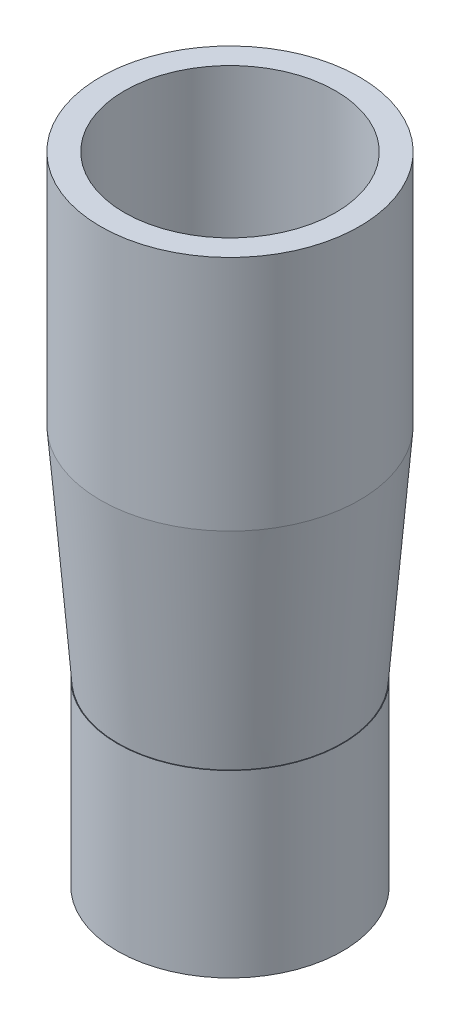
ISO-10303-21;
HEADER;
FILE_DESCRIPTION(('STEP AP214'),'2;1');
FILE_NAME('part.step','',(''),(''),'','','');
FILE_SCHEMA(('AUTOMOTIVE_DESIGN { 1 0 10303 214 1 1 1 1 }'));
ENDSEC;
DATA;
#1=APPLICATION_CONTEXT('core data for automotive mechanical design processes');
#2=APPLICATION_PROTOCOL_DEFINITION('international standard','automotive_design',2000,#1);
#3=PRODUCT_CONTEXT('',#1,'mechanical');
#4=PRODUCT('Part','Part','',(#3));
#5=PRODUCT_RELATED_PRODUCT_CATEGORY('part','',(#4));
#6=PRODUCT_DEFINITION_FORMATION('','',#4);
#7=PRODUCT_DEFINITION_CONTEXT('part definition',#1,'design');
#8=PRODUCT_DEFINITION('design','',#6,#7);
#9=PRODUCT_DEFINITION_SHAPE('','',#8);
#10=(LENGTH_UNIT() NAMED_UNIT(*) SI_UNIT(.MILLI.,.METRE.));
#11=(NAMED_UNIT(*) PLANE_ANGLE_UNIT() SI_UNIT($,.RADIAN.));
#12=(NAMED_UNIT(*) SI_UNIT($,.STERADIAN.) SOLID_ANGLE_UNIT());
#13=UNCERTAINTY_MEASURE_WITH_UNIT(LENGTH_MEASURE(1.E-05),#10,'distance_accuracy_value','');
#14=(GEOMETRIC_REPRESENTATION_CONTEXT(3) GLOBAL_UNCERTAINTY_ASSIGNED_CONTEXT((#13)) GLOBAL_UNIT_ASSIGNED_CONTEXT((#10,
#11,#12)) REPRESENTATION_CONTEXT('',''));
#15=CARTESIAN_POINT('',(0.,0.,0.));
#16=DIRECTION('',(0.,0.,1.));
#17=DIRECTION('',(1.,0.,0.));
#18=AXIS2_PLACEMENT_3D('',#15,#16,#17);
#19=CARTESIAN_POINT('',(-25.6120969503537,36.1163177549968,0.));
#20=DIRECTION('',(0.,1.,0.));
#21=DIRECTION('',(0.,0.,1.));
#22=AXIS2_PLACEMENT_3D('',#19,#20,#21);
#23=PLANE('',#22);
#24=CARTESIAN_POINT('',(-14.7970969503537,36.1163177549968,0.));
#25=DIRECTION('',(0.,1.,0.));
#26=DIRECTION('',(0.,0.,1.));
#27=AXIS2_PLACEMENT_3D('',#24,#25,#26);
#28=CIRCLE('',#27,10.815);
#29=CARTESIAN_POINT('',(-14.7970969503537,36.1163177549968,10.815));
#30=VERTEX_POINT('',#29);
#31=EDGE_CURVE('E10',#30,#30,#28,.T.);
#32=ORIENTED_EDGE('',*,*,#31,.T.);
#33=EDGE_LOOP('',(#32));
#34=FACE_BOUND('',#33,.T.);
#35=CARTESIAN_POINT('',(-14.7970969503537,36.1163177549968,0.));
#36=DIRECTION('',(0.,1.,0.));
#37=DIRECTION('',(0.,0.,1.));
#38=AXIS2_PLACEMENT_3D('',#35,#36,#37);
#39=CIRCLE('',#38,8.815);
#40=CARTESIAN_POINT('',(-14.7970969503537,36.1163177549968,8.815));
#41=VERTEX_POINT('',#40);
#42=EDGE_CURVE('E22',#41,#41,#39,.T.);
#43=ORIENTED_EDGE('',*,*,#42,.F.);
#44=EDGE_LOOP('',(#43));
#45=FACE_BOUND('',#44,.T.);
#46=ADVANCED_FACE('F15',(#34,#45),#23,.T.);
#47=CARTESIAN_POINT('',(-14.7970969503537,26.4248387096774,0.));
#48=DIRECTION('',(0.,1.,0.));
#49=DIRECTION('',(0.,0.,1.));
#50=AXIS2_PLACEMENT_3D('',#47,#48,#49);
#51=CYLINDRICAL_SURFACE('',#50,8.815);
#52=ORIENTED_EDGE('',*,*,#42,.T.);
#53=EDGE_LOOP('',(#52));
#54=FACE_BOUND('',#53,.T.);
#55=CARTESIAN_POINT('',(-14.7970969503537,16.3263177549968,0.));
#56=DIRECTION('',(0.,1.,0.));
#57=DIRECTION('',(0.,0.,1.));
#58=AXIS2_PLACEMENT_3D('',#55,#56,#57);
#59=CIRCLE('',#58,8.815);
#60=CARTESIAN_POINT('',(-14.7970969503537,16.3263177549968,8.815));
#61=VERTEX_POINT('',#60);
#62=EDGE_CURVE('E29',#61,#61,#59,.T.);
#63=ORIENTED_EDGE('',*,*,#62,.F.);
#64=EDGE_LOOP('',(#63));
#65=FACE_BOUND('',#64,.T.);
#66=ADVANCED_FACE('F82',(#54,#65),#51,.F.);
#67=CARTESIAN_POINT('',(-14.7970969503537,-7.13260368102019,0.));
#68=DIRECTION('',(0.,1.,0.));
#69=DIRECTION('',(0.,0.,1.));
#70=AXIS2_PLACEMENT_3D('',#67,#68,#69);
#71=CONICAL_SURFACE('',#70,6.94160278866409,0.0796895082429436);
#72=ORIENTED_EDGE('',*,*,#62,.T.);
#73=EDGE_LOOP('',(#72));
#74=FACE_BOUND('',#73,.T.);
#75=CARTESIAN_POINT('',(-14.7970969503537,-7.13260368102019,0.));
#76=DIRECTION('',(0.,1.,0.));
#77=DIRECTION('',(0.,0.,1.));
#78=AXIS2_PLACEMENT_3D('',#75,#76,#77);
#79=CIRCLE('',#78,6.94160278866409);
#80=CARTESIAN_POINT('',(-14.7970969503537,-7.13260368102019,6.94160278866409));
#81=VERTEX_POINT('',#80);
#82=EDGE_CURVE('E35',#81,#81,#79,.T.);
#83=ORIENTED_EDGE('',*,*,#82,.F.);
#84=EDGE_LOOP('',(#83));
#85=FACE_BOUND('',#84,.T.);
#86=ADVANCED_FACE('F86',(#74,#85),#71,.F.);
#87=CARTESIAN_POINT('',(-14.7970969503537,26.4248387096774,0.));
#88=DIRECTION('',(0.,1.,0.));
#89=DIRECTION('',(0.,0.,1.));
#90=AXIS2_PLACEMENT_3D('',#87,#88,#89);
#91=CYLINDRICAL_SURFACE('',#90,6.94160278866409);
#92=ORIENTED_EDGE('',*,*,#82,.T.);
#93=EDGE_LOOP('',(#92));
#94=FACE_BOUND('',#93,.T.);
#95=CARTESIAN_POINT('',(-14.7970969503537,-16.9873258973576,0.));
#96=DIRECTION('',(0.,1.,0.));
#97=DIRECTION('',(0.,0.,1.));
#98=AXIS2_PLACEMENT_3D('',#95,#96,#97);
#99=CIRCLE('',#98,6.9416027886641);
#100=CARTESIAN_POINT('',(-14.7970969503537,-16.9873258973576,6.9416027886641));
#101=VERTEX_POINT('',#100);
#102=EDGE_CURVE('E41',#101,#101,#99,.T.);
#103=ORIENTED_EDGE('',*,*,#102,.F.);
#104=EDGE_LOOP('',(#103));
#105=FACE_BOUND('',#104,.T.);
#106=ADVANCED_FACE('F91',(#94,#105),#91,.F.);
#107=CARTESIAN_POINT('',(-24.1995949232433,-16.9873258973576,0.));
#108=DIRECTION('',(0.,-1.,0.));
#109=DIRECTION('',(0.,0.,-1.));
#110=AXIS2_PLACEMENT_3D('',#107,#108,#109);
#111=PLANE('',#110);
#112=ORIENTED_EDGE('',*,*,#102,.T.);
#113=EDGE_LOOP('',(#112));
#114=FACE_BOUND('',#113,.T.);
#115=CARTESIAN_POINT('',(-14.7970969503537,-16.9873258973576,0.));
#116=DIRECTION('',(0.,1.,0.));
#117=DIRECTION('',(0.,0.,1.));
#118=AXIS2_PLACEMENT_3D('',#115,#116,#117);
#119=CIRCLE('',#118,9.40249797288959);
#120=CARTESIAN_POINT('',(-14.7970969503537,-16.9873258973576,9.40249797288959));
#121=VERTEX_POINT('',#120);
#122=EDGE_CURVE('E45',#121,#121,#119,.T.);
#123=ORIENTED_EDGE('',*,*,#122,.F.);
#124=EDGE_LOOP('',(#123));
#125=FACE_BOUND('',#124,.T.);
#126=ADVANCED_FACE('F98',(#114,#125),#111,.T.);
#127=CARTESIAN_POINT('',(-14.7970969503537,26.4248387096774,0.));
#128=DIRECTION('',(0.,1.,0.));
#129=DIRECTION('',(0.,0.,1.));
#130=AXIS2_PLACEMENT_3D('',#127,#128,#129);
#131=CYLINDRICAL_SURFACE('',#130,9.40249797288959);
#132=ORIENTED_EDGE('',*,*,#122,.T.);
#133=EDGE_LOOP('',(#132));
#134=FACE_BOUND('',#133,.T.);
#135=CARTESIAN_POINT('',(-14.7970969503537,-1.98732120336022,0.));
#136=DIRECTION('',(0.,1.,0.));
#137=DIRECTION('',(0.,0.,1.));
#138=AXIS2_PLACEMENT_3D('',#135,#136,#137);
#139=CIRCLE('',#138,9.40249797288959);
#140=CARTESIAN_POINT('',(-14.7970969503537,-1.98732120336022,9.40249797288959));
#141=VERTEX_POINT('',#140);
#142=EDGE_CURVE('E49',#141,#141,#139,.T.);
#143=ORIENTED_EDGE('',*,*,#142,.F.);
#144=EDGE_LOOP('',(#143));
#145=FACE_BOUND('',#144,.T.);
#146=ADVANCED_FACE('F78',(#134,#145),#131,.T.);
#147=CARTESIAN_POINT('',(-24.1495949232433,-1.98732120336023,0.));
#148=DIRECTION('',(0.,1.,0.));
#149=DIRECTION('',(0.,0.,1.));
#150=AXIS2_PLACEMENT_3D('',#147,#148,#149);
#151=PLANE('',#150);
#152=ORIENTED_EDGE('',*,*,#142,.T.);
#153=EDGE_LOOP('',(#152));
#154=FACE_BOUND('',#153,.T.);
#155=CARTESIAN_POINT('',(-14.7970969503537,-1.98732120336022,0.));
#156=DIRECTION('',(0.,1.,0.));
#157=DIRECTION('',(0.,0.,1.));
#158=AXIS2_PLACEMENT_3D('',#155,#156,#157);
#159=CIRCLE('',#158,9.35249797288959);
#160=CARTESIAN_POINT('',(-14.7970969503537,-1.98732120336022,9.35249797288959));
#161=VERTEX_POINT('',#160);
#162=EDGE_CURVE('E53',#161,#161,#159,.T.);
#163=ORIENTED_EDGE('',*,*,#162,.F.);
#164=EDGE_LOOP('',(#163));
#165=FACE_BOUND('',#164,.T.);
#166=ADVANCED_FACE('F69',(#154,#165),#151,.T.);
#167=CARTESIAN_POINT('',(-14.7970969503537,16.3263177549968,0.));
#168=DIRECTION('',(0.,1.,0.));
#169=DIRECTION('',(0.,0.,1.));
#170=AXIS2_PLACEMENT_3D('',#167,#168,#169);
#171=CONICAL_SURFACE('',#170,10.815,0.0796895082429434);
#172=ORIENTED_EDGE('',*,*,#162,.T.);
#173=EDGE_LOOP('',(#172));
#174=FACE_BOUND('',#173,.T.);
#175=CARTESIAN_POINT('',(-14.7970969503537,16.3263177549968,0.));
#176=DIRECTION('',(0.,1.,0.));
#177=DIRECTION('',(0.,0.,1.));
#178=AXIS2_PLACEMENT_3D('',#175,#176,#177);
#179=CIRCLE('',#178,10.815);
#180=CARTESIAN_POINT('',(-14.7970969503537,16.3263177549968,10.815));
#181=VERTEX_POINT('',#180);
#182=EDGE_CURVE('E57',#181,#181,#179,.T.);
#183=ORIENTED_EDGE('',*,*,#182,.F.);
#184=EDGE_LOOP('',(#183));
#185=FACE_BOUND('',#184,.T.);
#186=ADVANCED_FACE('F67',(#174,#185),#171,.T.);
#187=CARTESIAN_POINT('',(-14.7970969503537,26.4248387096774,0.));
#188=DIRECTION('',(0.,1.,0.));
#189=DIRECTION('',(0.,0.,1.));
#190=AXIS2_PLACEMENT_3D('',#187,#188,#189);
#191=CYLINDRICAL_SURFACE('',#190,10.815);
#192=ORIENTED_EDGE('',*,*,#182,.T.);
#193=EDGE_LOOP('',(#192));
#194=FACE_BOUND('',#193,.T.);
#195=ORIENTED_EDGE('',*,*,#31,.F.);
#196=EDGE_LOOP('',(#195));
#197=FACE_BOUND('',#196,.T.);
#198=ADVANCED_FACE('F64',(#194,#197),#191,.T.);
#199=CLOSED_SHELL('',(#46,#66,#86,#106,#126,#146,#166,#186,#198));
#200=MANIFOLD_SOLID_BREP('B1',#199);
#201=ADVANCED_BREP_SHAPE_REPRESENTATION('',(#18,#200),#14);
#202=SHAPE_DEFINITION_REPRESENTATION(#9,#201);
ENDSEC;
END-ISO-10303-21;
